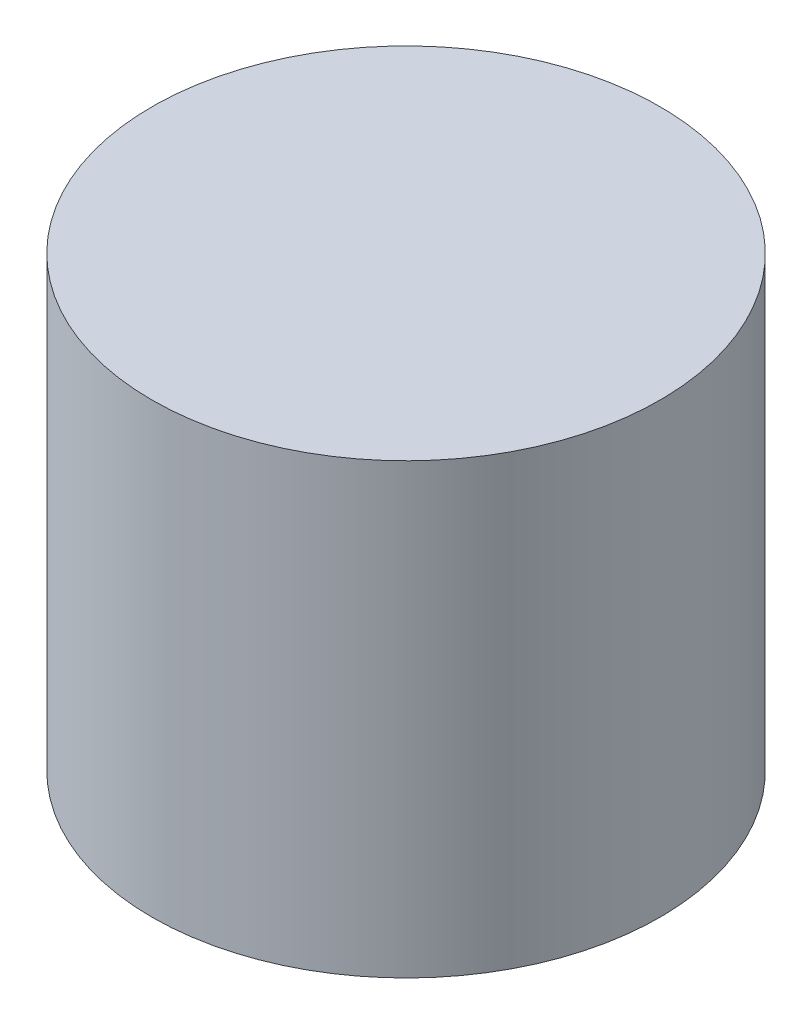
ISO-10303-21;
HEADER;
FILE_DESCRIPTION(('STEP AP214'),'2;1');
FILE_NAME('part.step','',(''),(''),'','','');
FILE_SCHEMA(('AUTOMOTIVE_DESIGN { 1 0 10303 214 1 1 1 1 }'));
ENDSEC;
DATA;
#1=APPLICATION_CONTEXT('core data for automotive mechanical design processes');
#2=APPLICATION_PROTOCOL_DEFINITION('international standard','automotive_design',2000,#1);
#3=PRODUCT_CONTEXT('',#1,'mechanical');
#4=PRODUCT('Part','Part','',(#3));
#5=PRODUCT_RELATED_PRODUCT_CATEGORY('part','',(#4));
#6=PRODUCT_DEFINITION_FORMATION('','',#4);
#7=PRODUCT_DEFINITION_CONTEXT('part definition',#1,'design');
#8=PRODUCT_DEFINITION('design','',#6,#7);
#9=PRODUCT_DEFINITION_SHAPE('','',#8);
#10=(LENGTH_UNIT() NAMED_UNIT(*) SI_UNIT(.MILLI.,.METRE.));
#11=(NAMED_UNIT(*) PLANE_ANGLE_UNIT() SI_UNIT($,.RADIAN.));
#12=(NAMED_UNIT(*) SI_UNIT($,.STERADIAN.) SOLID_ANGLE_UNIT());
#13=UNCERTAINTY_MEASURE_WITH_UNIT(LENGTH_MEASURE(1.E-05),#10,'distance_accuracy_value','');
#14=(GEOMETRIC_REPRESENTATION_CONTEXT(3) GLOBAL_UNCERTAINTY_ASSIGNED_CONTEXT((#13)) GLOBAL_UNIT_ASSIGNED_CONTEXT((#10,
#11,#12)) REPRESENTATION_CONTEXT('',''));
#15=CARTESIAN_POINT('',(0.,0.,0.));
#16=DIRECTION('',(0.,0.,1.));
#17=DIRECTION('',(1.,0.,0.));
#18=AXIS2_PLACEMENT_3D('',#15,#16,#17);
#19=CARTESIAN_POINT('',(0.,50.,0.));
#20=DIRECTION('',(0.,-1.,0.));
#21=DIRECTION('',(0.,0.,-1.));
#22=AXIS2_PLACEMENT_3D('',#19,#20,#21);
#23=CYLINDRICAL_SURFACE('',#22,28.3607727956305);
#24=CARTESIAN_POINT('',(0.,50.,0.));
#25=DIRECTION('',(0.,1.,0.));
#26=DIRECTION('',(0.,0.,1.));
#27=AXIS2_PLACEMENT_3D('',#24,#25,#26);
#28=CIRCLE('',#27,28.3607727956305);
#29=CARTESIAN_POINT('',(0.,50.,28.3607727956305));
#30=VERTEX_POINT('',#29);
#31=EDGE_CURVE('E10',#30,#30,#28,.T.);
#32=ORIENTED_EDGE('',*,*,#31,.F.);
#33=EDGE_LOOP('',(#32));
#34=FACE_BOUND('',#33,.T.);
#35=CARTESIAN_POINT('',(0.,0.,0.));
#36=DIRECTION('',(0.,1.,0.));
#37=DIRECTION('',(0.,0.,1.));
#38=AXIS2_PLACEMENT_3D('',#35,#36,#37);
#39=CIRCLE('',#38,28.3607727956305);
#40=CARTESIAN_POINT('',(0.,0.,28.3607727956305));
#41=VERTEX_POINT('',#40);
#42=EDGE_CURVE('E46',#41,#41,#39,.T.);
#43=ORIENTED_EDGE('',*,*,#42,.T.);
#44=EDGE_LOOP('',(#43));
#45=FACE_BOUND('',#44,.T.);
#46=ADVANCED_FACE('F43',(#34,#45),#23,.T.);
#47=CARTESIAN_POINT('',(0.,50.,0.));
#48=DIRECTION('',(0.,1.,0.));
#49=DIRECTION('',(0.,0.,1.));
#50=AXIS2_PLACEMENT_3D('',#47,#48,#49);
#51=PLANE('',#50);
#52=ORIENTED_EDGE('',*,*,#31,.T.);
#53=EDGE_LOOP('',(#52));
#54=FACE_BOUND('',#53,.T.);
#55=ADVANCED_FACE('F60',(#54),#51,.T.);
#56=CARTESIAN_POINT('',(0.,0.,0.));
#57=DIRECTION('',(0.,1.,0.));
#58=DIRECTION('',(0.,0.,1.));
#59=AXIS2_PLACEMENT_3D('',#56,#57,#58);
#60=PLANE('',#59);
#61=ORIENTED_EDGE('',*,*,#42,.F.);
#62=EDGE_LOOP('',(#61));
#63=FACE_BOUND('',#62,.T.);
#64=ADVANCED_FACE('F58',(#63),#60,.F.);
#65=CLOSED_SHELL('',(#46,#55,#64));
#66=MANIFOLD_SOLID_BREP('B2',#65);
#67=ADVANCED_BREP_SHAPE_REPRESENTATION('',(#18,#66),#14);
#68=SHAPE_DEFINITION_REPRESENTATION(#9,#67);
ENDSEC;
END-ISO-10303-21;
